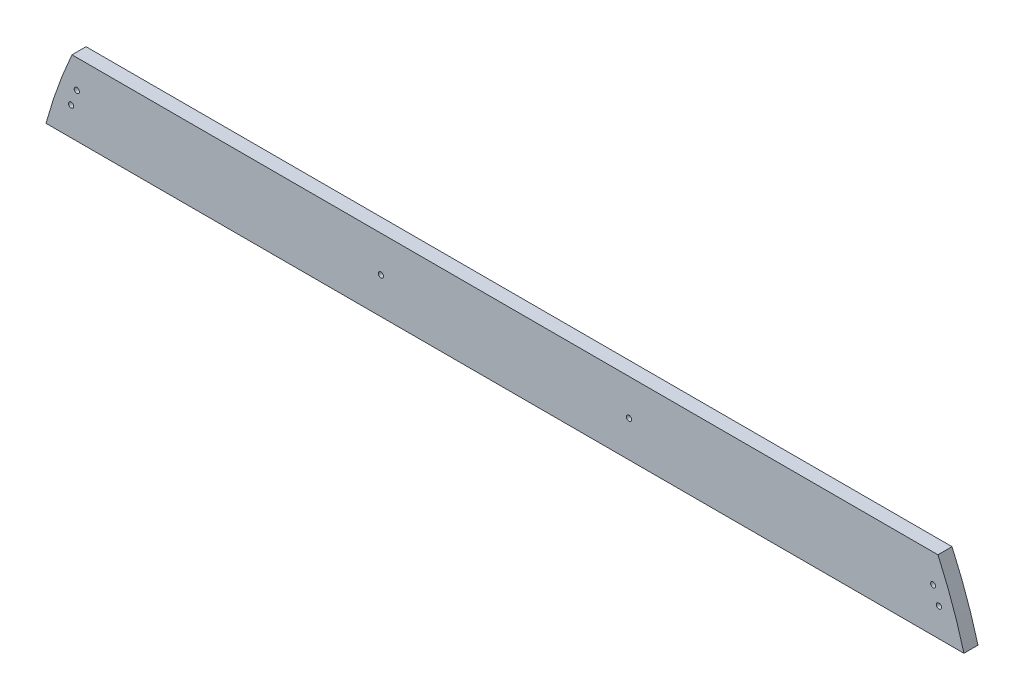
ISO-10303-21;
HEADER;
FILE_DESCRIPTION(('STEP AP214'),'2;1');
FILE_NAME('part.step','',(''),(''),'','','');
FILE_SCHEMA(('AUTOMOTIVE_DESIGN { 1 0 10303 214 1 1 1 1 }'));
ENDSEC;
DATA;
#1=APPLICATION_CONTEXT('core data for automotive mechanical design processes');
#2=APPLICATION_PROTOCOL_DEFINITION('international standard','automotive_design',2000,#1);
#3=PRODUCT_CONTEXT('',#1,'mechanical');
#4=PRODUCT('Part','Part','',(#3));
#5=PRODUCT_RELATED_PRODUCT_CATEGORY('part','',(#4));
#6=PRODUCT_DEFINITION_FORMATION('','',#4);
#7=PRODUCT_DEFINITION_CONTEXT('part definition',#1,'design');
#8=PRODUCT_DEFINITION('design','',#6,#7);
#9=PRODUCT_DEFINITION_SHAPE('','',#8);
#10=(LENGTH_UNIT() NAMED_UNIT(*) SI_UNIT(.MILLI.,.METRE.));
#11=(NAMED_UNIT(*) PLANE_ANGLE_UNIT() SI_UNIT($,.RADIAN.));
#12=(NAMED_UNIT(*) SI_UNIT($,.STERADIAN.) SOLID_ANGLE_UNIT());
#13=UNCERTAINTY_MEASURE_WITH_UNIT(LENGTH_MEASURE(1.E-05),#10,'distance_accuracy_value','');
#14=(GEOMETRIC_REPRESENTATION_CONTEXT(3) GLOBAL_UNCERTAINTY_ASSIGNED_CONTEXT((#13)) GLOBAL_UNIT_ASSIGNED_CONTEXT((#10,
#11,#12)) REPRESENTATION_CONTEXT('',''));
#15=CARTESIAN_POINT('',(0.,0.,0.));
#16=DIRECTION('',(0.,0.,1.));
#17=DIRECTION('',(1.,0.,0.));
#18=AXIS2_PLACEMENT_3D('',#15,#16,#17);
#19=CARTESIAN_POINT('',(0.,152.4,17.272));
#20=DIRECTION('',(0.,1.,0.));
#21=DIRECTION('',(0.,0.,1.));
#22=AXIS2_PLACEMENT_3D('',#19,#20,#21);
#23=PLANE('',#22);
#24=DIRECTION('',(1.,0.,0.));
#25=VECTOR('',#24,1.);
#26=CARTESIAN_POINT('',(0.,152.4,0.));
#27=LINE('',#26,#25);
#28=CARTESIAN_POINT('',(-563.971524103833,152.4,0.));
#29=VERTEX_POINT('',#28);
#30=CARTESIAN_POINT('',(563.971524103833,152.4,0.));
#31=VERTEX_POINT('',#30);
#32=EDGE_CURVE('E110',#29,#31,#27,.T.);
#33=ORIENTED_EDGE('',*,*,#32,.T.);
#34=DIRECTION('',(0.,0.,-1.));
#35=VECTOR('',#34,1.);
#36=CARTESIAN_POINT('',(563.971524103833,152.4,17.272));
#37=LINE('',#36,#35);
#38=CARTESIAN_POINT('',(563.971524103833,152.4,17.272));
#39=VERTEX_POINT('',#38);
#40=EDGE_CURVE('E11',#39,#31,#37,.T.);
#41=ORIENTED_EDGE('',*,*,#40,.F.);
#42=DIRECTION('',(1.,0.,0.));
#43=VECTOR('',#42,1.);
#44=CARTESIAN_POINT('',(0.,152.4,17.272));
#45=LINE('',#44,#43);
#46=CARTESIAN_POINT('',(-563.971524103833,152.4,17.272));
#47=VERTEX_POINT('',#46);
#48=EDGE_CURVE('E82',#47,#39,#45,.T.);
#49=ORIENTED_EDGE('',*,*,#48,.F.);
#50=DIRECTION('',(0.,0.,-1.));
#51=VECTOR('',#50,1.);
#52=CARTESIAN_POINT('',(-563.971524103833,152.4,17.272));
#53=LINE('',#52,#51);
#54=EDGE_CURVE('E93',#47,#29,#53,.T.);
#55=ORIENTED_EDGE('',*,*,#54,.T.);
#56=EDGE_LOOP('',(#33,#41,#49,#55));
#57=FACE_BOUND('',#56,.T.);
#58=ADVANCED_FACE('F34',(#57),#23,.F.);
#59=CARTESIAN_POINT('',(0.,0.,17.272));
#60=DIRECTION('',(0.,0.,-1.));
#61=DIRECTION('',(-1.,0.,0.));
#62=AXIS2_PLACEMENT_3D('',#59,#60,#61);
#63=CYLINDRICAL_SURFACE('',#62,584.2);
#64=CARTESIAN_POINT('',(0.,0.,0.));
#65=DIRECTION('',(0.,0.,1.));
#66=DIRECTION('',(1.,0.,0.));
#67=AXIS2_PLACEMENT_3D('',#64,#65,#66);
#68=CIRCLE('',#67,584.2);
#69=CARTESIAN_POINT('',(532.037545667597,241.3,0.));
#70=VERTEX_POINT('',#69);
#71=EDGE_CURVE('E87',#31,#70,#68,.T.);
#72=ORIENTED_EDGE('',*,*,#71,.T.);
#73=DIRECTION('',(0.,0.,-1.));
#74=VECTOR('',#73,1.);
#75=CARTESIAN_POINT('',(532.037545667597,241.3,17.272));
#76=LINE('',#75,#74);
#77=CARTESIAN_POINT('',(532.037545667597,241.3,17.272));
#78=VERTEX_POINT('',#77);
#79=EDGE_CURVE('E43',#78,#70,#76,.T.);
#80=ORIENTED_EDGE('',*,*,#79,.F.);
#81=CARTESIAN_POINT('',(0.,0.,17.272));
#82=DIRECTION('',(0.,0.,1.));
#83=DIRECTION('',(1.,0.,0.));
#84=AXIS2_PLACEMENT_3D('',#81,#82,#83);
#85=CIRCLE('',#84,584.2);
#86=EDGE_CURVE('E77',#39,#78,#85,.T.);
#87=ORIENTED_EDGE('',*,*,#86,.F.);
#88=ORIENTED_EDGE('',*,*,#40,.T.);
#89=EDGE_LOOP('',(#72,#80,#87,#88));
#90=FACE_BOUND('',#89,.T.);
#91=ADVANCED_FACE('F86',(#90),#63,.T.);
#92=CARTESIAN_POINT('',(0.,241.3,17.272));
#93=DIRECTION('',(0.,1.,0.));
#94=DIRECTION('',(0.,0.,1.));
#95=AXIS2_PLACEMENT_3D('',#92,#93,#94);
#96=PLANE('',#95);
#97=DIRECTION('',(1.,0.,0.));
#98=VECTOR('',#97,1.);
#99=CARTESIAN_POINT('',(0.,241.3,0.));
#100=LINE('',#99,#98);
#101=CARTESIAN_POINT('',(-532.037545667597,241.3,0.));
#102=VERTEX_POINT('',#101);
#103=EDGE_CURVE('E114',#102,#70,#100,.T.);
#104=ORIENTED_EDGE('',*,*,#103,.F.);
#105=DIRECTION('',(0.,0.,-1.));
#106=VECTOR('',#105,1.);
#107=CARTESIAN_POINT('',(-532.037545667597,241.3,17.272));
#108=LINE('',#107,#106);
#109=CARTESIAN_POINT('',(-532.037545667597,241.3,17.272));
#110=VERTEX_POINT('',#109);
#111=EDGE_CURVE('E67',#110,#102,#108,.T.);
#112=ORIENTED_EDGE('',*,*,#111,.F.);
#113=DIRECTION('',(1.,0.,0.));
#114=VECTOR('',#113,1.);
#115=CARTESIAN_POINT('',(0.,241.3,17.272));
#116=LINE('',#115,#114);
#117=EDGE_CURVE('E80',#110,#78,#116,.T.);
#118=ORIENTED_EDGE('',*,*,#117,.T.);
#119=ORIENTED_EDGE('',*,*,#79,.T.);
#120=EDGE_LOOP('',(#104,#112,#118,#119));
#121=FACE_BOUND('',#120,.T.);
#122=ADVANCED_FACE('F91',(#121),#96,.T.);
#123=CARTESIAN_POINT('',(-526.12154667434,206.375,17.272));
#124=DIRECTION('',(0.,0.,-1.));
#125=DIRECTION('',(-1.,0.,0.));
#126=AXIS2_PLACEMENT_3D('',#123,#124,#125);
#127=CYLINDRICAL_SURFACE('',#126,3.17500000000009);
#128=CARTESIAN_POINT('',(-526.12154667434,206.375,17.272));
#129=DIRECTION('',(0.,0.,1.));
#130=DIRECTION('',(1.,0.,0.));
#131=AXIS2_PLACEMENT_3D('',#128,#129,#130);
#132=CIRCLE('',#131,3.17500000000009);
#133=CARTESIAN_POINT('',(-522.94654667434,206.375,17.272));
#134=VERTEX_POINT('',#133);
#135=EDGE_CURVE('E178',#134,#134,#132,.T.);
#136=ORIENTED_EDGE('',*,*,#135,.T.);
#137=EDGE_LOOP('',(#136));
#138=FACE_BOUND('',#137,.T.);
#139=CARTESIAN_POINT('',(-526.12154667434,206.375,0.));
#140=DIRECTION('',(0.,0.,1.));
#141=DIRECTION('',(1.,0.,0.));
#142=AXIS2_PLACEMENT_3D('',#139,#140,#141);
#143=CIRCLE('',#142,3.17500000000009);
#144=CARTESIAN_POINT('',(-522.94654667434,206.375,0.));
#145=VERTEX_POINT('',#144);
#146=EDGE_CURVE('E107',#145,#145,#143,.T.);
#147=ORIENTED_EDGE('',*,*,#146,.F.);
#148=EDGE_LOOP('',(#147));
#149=FACE_BOUND('',#148,.T.);
#150=ADVANCED_FACE('F148',(#138,#149),#127,.F.);
#151=CARTESIAN_POINT('',(-533.201525574524,187.325,17.272));
#152=DIRECTION('',(0.,0.,-1.));
#153=DIRECTION('',(-1.,0.,0.));
#154=AXIS2_PLACEMENT_3D('',#151,#152,#153);
#155=CYLINDRICAL_SURFACE('',#154,3.17500000000009);
#156=CARTESIAN_POINT('',(-533.201525574524,187.325,17.272));
#157=DIRECTION('',(0.,0.,1.));
#158=DIRECTION('',(1.,0.,0.));
#159=AXIS2_PLACEMENT_3D('',#156,#157,#158);
#160=CIRCLE('',#159,3.17500000000009);
#161=CARTESIAN_POINT('',(-530.026525574524,187.325,17.272));
#162=VERTEX_POINT('',#161);
#163=EDGE_CURVE('E175',#162,#162,#160,.T.);
#164=ORIENTED_EDGE('',*,*,#163,.T.);
#165=EDGE_LOOP('',(#164));
#166=FACE_BOUND('',#165,.T.);
#167=CARTESIAN_POINT('',(-533.201525574524,187.325,0.));
#168=DIRECTION('',(0.,0.,1.));
#169=DIRECTION('',(1.,0.,0.));
#170=AXIS2_PLACEMENT_3D('',#167,#168,#169);
#171=CIRCLE('',#170,3.17500000000009);
#172=CARTESIAN_POINT('',(-530.026525574524,187.325,0.));
#173=VERTEX_POINT('',#172);
#174=EDGE_CURVE('E104',#173,#173,#171,.T.);
#175=ORIENTED_EDGE('',*,*,#174,.F.);
#176=EDGE_LOOP('',(#175));
#177=FACE_BOUND('',#176,.T.);
#178=ADVANCED_FACE('F151',(#166,#177),#155,.F.);
#179=CARTESIAN_POINT('',(526.12154667434,206.375,17.272));
#180=DIRECTION('',(0.,0.,-1.));
#181=DIRECTION('',(-1.,0.,0.));
#182=AXIS2_PLACEMENT_3D('',#179,#180,#181);
#183=CYLINDRICAL_SURFACE('',#182,3.17500000000009);
#184=CARTESIAN_POINT('',(526.12154667434,206.375,17.272));
#185=DIRECTION('',(0.,0.,1.));
#186=DIRECTION('',(1.,0.,0.));
#187=AXIS2_PLACEMENT_3D('',#184,#185,#186);
#188=CIRCLE('',#187,3.17500000000009);
#189=CARTESIAN_POINT('',(529.29654667434,206.375,17.272));
#190=VERTEX_POINT('',#189);
#191=EDGE_CURVE('E165',#190,#190,#188,.T.);
#192=ORIENTED_EDGE('',*,*,#191,.T.);
#193=EDGE_LOOP('',(#192));
#194=FACE_BOUND('',#193,.T.);
#195=CARTESIAN_POINT('',(526.12154667434,206.375,0.));
#196=DIRECTION('',(0.,0.,1.));
#197=DIRECTION('',(1.,0.,0.));
#198=AXIS2_PLACEMENT_3D('',#195,#196,#197);
#199=CIRCLE('',#198,3.17500000000009);
#200=CARTESIAN_POINT('',(529.29654667434,206.375,0.));
#201=VERTEX_POINT('',#200);
#202=EDGE_CURVE('E100',#201,#201,#199,.T.);
#203=ORIENTED_EDGE('',*,*,#202,.F.);
#204=EDGE_LOOP('',(#203));
#205=FACE_BOUND('',#204,.T.);
#206=ADVANCED_FACE('F154',(#194,#205),#183,.F.);
#207=CARTESIAN_POINT('',(533.201525574524,187.325,17.272));
#208=DIRECTION('',(0.,0.,-1.));
#209=DIRECTION('',(-1.,0.,0.));
#210=AXIS2_PLACEMENT_3D('',#207,#208,#209);
#211=CYLINDRICAL_SURFACE('',#210,3.17500000000009);
#212=CARTESIAN_POINT('',(533.201525574524,187.325,17.272));
#213=DIRECTION('',(0.,0.,1.));
#214=DIRECTION('',(1.,0.,0.));
#215=AXIS2_PLACEMENT_3D('',#212,#213,#214);
#216=CIRCLE('',#215,3.17500000000009);
#217=CARTESIAN_POINT('',(536.376525574524,187.325,17.272));
#218=VERTEX_POINT('',#217);
#219=EDGE_CURVE('E117',#218,#218,#216,.T.);
#220=ORIENTED_EDGE('',*,*,#219,.T.);
#221=EDGE_LOOP('',(#220));
#222=FACE_BOUND('',#221,.T.);
#223=CARTESIAN_POINT('',(533.201525574524,187.325,0.));
#224=DIRECTION('',(0.,0.,1.));
#225=DIRECTION('',(1.,0.,0.));
#226=AXIS2_PLACEMENT_3D('',#223,#224,#225);
#227=CIRCLE('',#226,3.17500000000009);
#228=CARTESIAN_POINT('',(536.376525574524,187.325,0.));
#229=VERTEX_POINT('',#228);
#230=EDGE_CURVE('E97',#229,#229,#227,.T.);
#231=ORIENTED_EDGE('',*,*,#230,.F.);
#232=EDGE_LOOP('',(#231));
#233=FACE_BOUND('',#232,.T.);
#234=ADVANCED_FACE('F36',(#222,#233),#211,.F.);
#235=CARTESIAN_POINT('',(0.,0.,17.272));
#236=DIRECTION('',(0.,0.,-1.));
#237=DIRECTION('',(-1.,0.,0.));
#238=AXIS2_PLACEMENT_3D('',#235,#236,#237);
#239=CYLINDRICAL_SURFACE('',#238,584.2);
#240=CARTESIAN_POINT('',(0.,0.,0.));
#241=DIRECTION('',(0.,0.,1.));
#242=DIRECTION('',(1.,0.,0.));
#243=AXIS2_PLACEMENT_3D('',#240,#241,#242);
#244=CIRCLE('',#243,584.2);
#245=EDGE_CURVE('E70',#102,#29,#244,.T.);
#246=ORIENTED_EDGE('',*,*,#245,.T.);
#247=ORIENTED_EDGE('',*,*,#54,.F.);
#248=CARTESIAN_POINT('',(0.,0.,17.272));
#249=DIRECTION('',(0.,0.,1.));
#250=DIRECTION('',(1.,0.,0.));
#251=AXIS2_PLACEMENT_3D('',#248,#249,#250);
#252=CIRCLE('',#251,584.2);
#253=EDGE_CURVE('E51',#110,#47,#252,.T.);
#254=ORIENTED_EDGE('',*,*,#253,.F.);
#255=ORIENTED_EDGE('',*,*,#111,.T.);
#256=EDGE_LOOP('',(#246,#247,#254,#255));
#257=FACE_BOUND('',#256,.T.);
#258=ADVANCED_FACE('F134',(#257),#239,.T.);
#259=CARTESIAN_POINT('',(0.,0.,17.272));
#260=DIRECTION('',(0.,0.,1.));
#261=DIRECTION('',(1.,0.,0.));
#262=AXIS2_PLACEMENT_3D('',#259,#260,#261);
#263=PLANE('',#262);
#264=CARTESIAN_POINT('',(152.4,196.85,17.272));
#265=DIRECTION('',(0.,0.,1.));
#266=DIRECTION('',(1.,0.,0.));
#267=AXIS2_PLACEMENT_3D('',#264,#265,#266);
#268=CIRCLE('',#267,3.175);
#269=CARTESIAN_POINT('',(155.575,196.85,17.272));
#270=VERTEX_POINT('',#269);
#271=EDGE_CURVE('E190',#270,#270,#268,.T.);
#272=ORIENTED_EDGE('',*,*,#271,.F.);
#273=EDGE_LOOP('',(#272));
#274=FACE_BOUND('',#273,.T.);
#275=CARTESIAN_POINT('',(-152.4,196.85,17.272));
#276=DIRECTION('',(0.,0.,1.));
#277=DIRECTION('',(1.,0.,0.));
#278=AXIS2_PLACEMENT_3D('',#275,#276,#277);
#279=CIRCLE('',#278,3.175);
#280=CARTESIAN_POINT('',(-149.225,196.85,17.272));
#281=VERTEX_POINT('',#280);
#282=EDGE_CURVE('E191',#281,#281,#279,.T.);
#283=ORIENTED_EDGE('',*,*,#282,.F.);
#284=EDGE_LOOP('',(#283));
#285=FACE_BOUND('',#284,.T.);
#286=ORIENTED_EDGE('',*,*,#219,.F.);
#287=EDGE_LOOP('',(#286));
#288=FACE_BOUND('',#287,.T.);
#289=ORIENTED_EDGE('',*,*,#191,.F.);
#290=EDGE_LOOP('',(#289));
#291=FACE_BOUND('',#290,.T.);
#292=ORIENTED_EDGE('',*,*,#163,.F.);
#293=EDGE_LOOP('',(#292));
#294=FACE_BOUND('',#293,.T.);
#295=ORIENTED_EDGE('',*,*,#135,.F.);
#296=EDGE_LOOP('',(#295));
#297=FACE_BOUND('',#296,.T.);
#298=ORIENTED_EDGE('',*,*,#48,.T.);
#299=ORIENTED_EDGE('',*,*,#86,.T.);
#300=ORIENTED_EDGE('',*,*,#117,.F.);
#301=ORIENTED_EDGE('',*,*,#253,.T.);
#302=EDGE_LOOP('',(#298,#299,#300,#301));
#303=FACE_BOUND('',#302,.T.);
#304=ADVANCED_FACE('F78',(#274,#285,#288,#291,#294,#297,#303),#263,.T.);
#305=CARTESIAN_POINT('',(0.,0.,0.));
#306=DIRECTION('',(0.,0.,1.));
#307=DIRECTION('',(1.,0.,0.));
#308=AXIS2_PLACEMENT_3D('',#305,#306,#307);
#309=PLANE('',#308);
#310=CARTESIAN_POINT('',(152.4,196.85,0.));
#311=DIRECTION('',(0.,0.,1.));
#312=DIRECTION('',(1.,0.,0.));
#313=AXIS2_PLACEMENT_3D('',#310,#311,#312);
#314=CIRCLE('',#313,3.175);
#315=CARTESIAN_POINT('',(155.575,196.85,0.));
#316=VERTEX_POINT('',#315);
#317=EDGE_CURVE('E101',#316,#316,#314,.F.);
#318=ORIENTED_EDGE('',*,*,#317,.F.);
#319=EDGE_LOOP('',(#318));
#320=FACE_BOUND('',#319,.T.);
#321=CARTESIAN_POINT('',(-152.4,196.85,0.));
#322=DIRECTION('',(0.,0.,1.));
#323=DIRECTION('',(1.,0.,0.));
#324=AXIS2_PLACEMENT_3D('',#321,#322,#323);
#325=CIRCLE('',#324,3.175);
#326=CARTESIAN_POINT('',(-149.225,196.85,0.));
#327=VERTEX_POINT('',#326);
#328=EDGE_CURVE('E187',#327,#327,#325,.F.);
#329=ORIENTED_EDGE('',*,*,#328,.F.);
#330=EDGE_LOOP('',(#329));
#331=FACE_BOUND('',#330,.T.);
#332=ORIENTED_EDGE('',*,*,#230,.T.);
#333=EDGE_LOOP('',(#332));
#334=FACE_BOUND('',#333,.T.);
#335=ORIENTED_EDGE('',*,*,#202,.T.);
#336=EDGE_LOOP('',(#335));
#337=FACE_BOUND('',#336,.T.);
#338=ORIENTED_EDGE('',*,*,#174,.T.);
#339=EDGE_LOOP('',(#338));
#340=FACE_BOUND('',#339,.T.);
#341=ORIENTED_EDGE('',*,*,#146,.T.);
#342=EDGE_LOOP('',(#341));
#343=FACE_BOUND('',#342,.T.);
#344=ORIENTED_EDGE('',*,*,#32,.F.);
#345=ORIENTED_EDGE('',*,*,#245,.F.);
#346=ORIENTED_EDGE('',*,*,#103,.T.);
#347=ORIENTED_EDGE('',*,*,#71,.F.);
#348=EDGE_LOOP('',(#344,#345,#346,#347));
#349=FACE_BOUND('',#348,.T.);
#350=ADVANCED_FACE('F122',(#320,#331,#334,#337,#340,#343,#349),#309,.F.);
#351=CARTESIAN_POINT('',(-152.4,196.85,-0.001000000000001));
#352=DIRECTION('',(0.,0.,1.));
#353=DIRECTION('',(1.,0.,0.));
#354=AXIS2_PLACEMENT_3D('',#351,#352,#353);
#355=CYLINDRICAL_SURFACE('',#354,3.175);
#356=ORIENTED_EDGE('',*,*,#282,.T.);
#357=EDGE_LOOP('',(#356));
#358=FACE_BOUND('',#357,.T.);
#359=ORIENTED_EDGE('',*,*,#328,.T.);
#360=EDGE_LOOP('',(#359));
#361=FACE_BOUND('',#360,.T.);
#362=ADVANCED_FACE('F124',(#358,#361),#355,.F.);
#363=CARTESIAN_POINT('',(152.4,196.85,-0.001000000000001));
#364=DIRECTION('',(0.,0.,1.));
#365=DIRECTION('',(1.,0.,0.));
#366=AXIS2_PLACEMENT_3D('',#363,#364,#365);
#367=CYLINDRICAL_SURFACE('',#366,3.175);
#368=ORIENTED_EDGE('',*,*,#271,.T.);
#369=EDGE_LOOP('',(#368));
#370=FACE_BOUND('',#369,.T.);
#371=ORIENTED_EDGE('',*,*,#317,.T.);
#372=EDGE_LOOP('',(#371));
#373=FACE_BOUND('',#372,.T.);
#374=ADVANCED_FACE('F131',(#370,#373),#367,.F.);
#375=CLOSED_SHELL('',(#58,#91,#122,#150,#178,#206,#234,#258,#304,#350,#362,#374));
#376=MANIFOLD_SOLID_BREP('B2',#375);
#377=ADVANCED_BREP_SHAPE_REPRESENTATION('',(#18,#376),#14);
#378=SHAPE_DEFINITION_REPRESENTATION(#9,#377);
ENDSEC;
END-ISO-10303-21;
